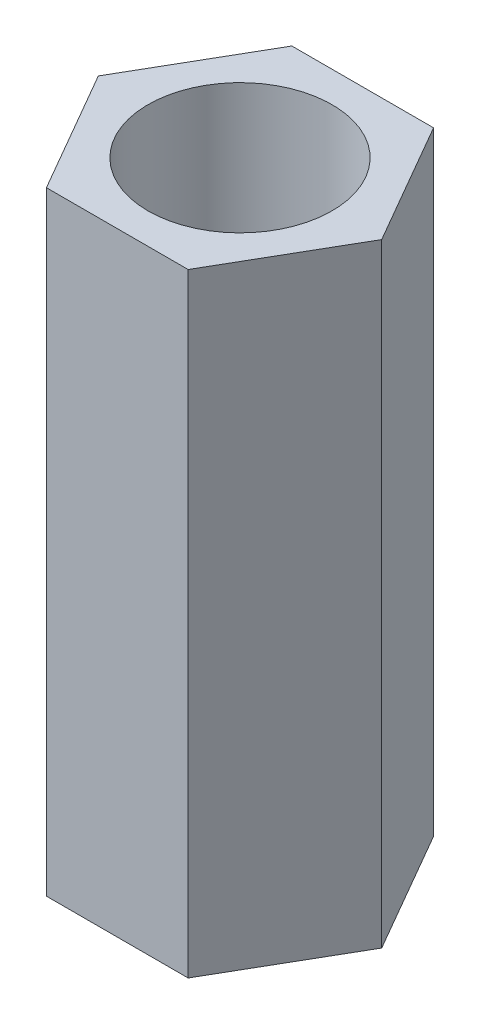
ISO-10303-21;
HEADER;
FILE_DESCRIPTION(('STEP AP214'),'2;1');
FILE_NAME('part.step','',(''),(''),'','','');
FILE_SCHEMA(('AUTOMOTIVE_DESIGN { 1 0 10303 214 1 1 1 1 }'));
ENDSEC;
DATA;
#1=APPLICATION_CONTEXT('core data for automotive mechanical design processes');
#2=APPLICATION_PROTOCOL_DEFINITION('international standard','automotive_design',2000,#1);
#3=PRODUCT_CONTEXT('',#1,'mechanical');
#4=PRODUCT('Part','Part','',(#3));
#5=PRODUCT_RELATED_PRODUCT_CATEGORY('part','',(#4));
#6=PRODUCT_DEFINITION_FORMATION('','',#4);
#7=PRODUCT_DEFINITION_CONTEXT('part definition',#1,'design');
#8=PRODUCT_DEFINITION('design','',#6,#7);
#9=PRODUCT_DEFINITION_SHAPE('','',#8);
#10=(LENGTH_UNIT() NAMED_UNIT(*) SI_UNIT(.MILLI.,.METRE.));
#11=(NAMED_UNIT(*) PLANE_ANGLE_UNIT() SI_UNIT($,.RADIAN.));
#12=(NAMED_UNIT(*) SI_UNIT($,.STERADIAN.) SOLID_ANGLE_UNIT());
#13=UNCERTAINTY_MEASURE_WITH_UNIT(LENGTH_MEASURE(1.E-05),#10,'distance_accuracy_value','');
#14=(GEOMETRIC_REPRESENTATION_CONTEXT(3) GLOBAL_UNCERTAINTY_ASSIGNED_CONTEXT((#13)) GLOBAL_UNIT_ASSIGNED_CONTEXT((#10,
#11,#12)) REPRESENTATION_CONTEXT('',''));
#15=CARTESIAN_POINT('',(0.,0.,0.));
#16=DIRECTION('',(0.,0.,1.));
#17=DIRECTION('',(1.,0.,0.));
#18=AXIS2_PLACEMENT_3D('',#15,#16,#17);
#19=CARTESIAN_POINT('',(1.15470053837925,10.,2.));
#20=DIRECTION('',(-0.866025403784439,0.,-0.5));
#21=DIRECTION('',(-0.5,0.,0.866025403784439));
#22=AXIS2_PLACEMENT_3D('',#19,#20,#21);
#23=PLANE('',#22);
#24=DIRECTION('',(0.5,0.,-0.866025403784439));
#25=VECTOR('',#24,1.);
#26=CARTESIAN_POINT('',(1.15470053837925,0.,2.));
#27=LINE('',#26,#25);
#28=CARTESIAN_POINT('',(1.15470053837925,0.,2.));
#29=VERTEX_POINT('',#28);
#30=CARTESIAN_POINT('',(2.3094010767585,0.,0.));
#31=VERTEX_POINT('',#30);
#32=EDGE_CURVE('E129',#29,#31,#27,.T.);
#33=ORIENTED_EDGE('',*,*,#32,.T.);
#34=DIRECTION('',(0.,-1.,0.));
#35=VECTOR('',#34,1.);
#36=CARTESIAN_POINT('',(2.3094010767585,10.,0.));
#37=LINE('',#36,#35);
#38=CARTESIAN_POINT('',(2.3094010767585,10.,0.));
#39=VERTEX_POINT('',#38);
#40=EDGE_CURVE('E11',#39,#31,#37,.T.);
#41=ORIENTED_EDGE('',*,*,#40,.F.);
#42=DIRECTION('',(0.5,0.,-0.866025403784439));
#43=VECTOR('',#42,1.);
#44=CARTESIAN_POINT('',(1.15470053837925,10.,2.));
#45=LINE('',#44,#43);
#46=CARTESIAN_POINT('',(1.15470053837925,10.,2.));
#47=VERTEX_POINT('',#46);
#48=EDGE_CURVE('E140',#47,#39,#45,.T.);
#49=ORIENTED_EDGE('',*,*,#48,.F.);
#50=DIRECTION('',(0.,-1.,0.));
#51=VECTOR('',#50,1.);
#52=CARTESIAN_POINT('',(1.15470053837925,10.,2.));
#53=LINE('',#52,#51);
#54=EDGE_CURVE('E125',#47,#29,#53,.T.);
#55=ORIENTED_EDGE('',*,*,#54,.T.);
#56=EDGE_LOOP('',(#33,#41,#49,#55));
#57=FACE_BOUND('',#56,.T.);
#58=ADVANCED_FACE('F45',(#57),#23,.F.);
#59=CARTESIAN_POINT('',(2.3094010767585,10.,0.));
#60=DIRECTION('',(-0.866025403784439,0.,0.5));
#61=DIRECTION('',(0.5,0.,0.866025403784439));
#62=AXIS2_PLACEMENT_3D('',#59,#60,#61);
#63=PLANE('',#62);
#64=DIRECTION('',(-0.5,0.,-0.866025403784438));
#65=VECTOR('',#64,1.);
#66=CARTESIAN_POINT('',(2.3094010767585,0.,0.));
#67=LINE('',#66,#65);
#68=CARTESIAN_POINT('',(1.15470053837925,0.,-2.));
#69=VERTEX_POINT('',#68);
#70=EDGE_CURVE('E132',#31,#69,#67,.T.);
#71=ORIENTED_EDGE('',*,*,#70,.T.);
#72=DIRECTION('',(0.,-1.,0.));
#73=VECTOR('',#72,1.);
#74=CARTESIAN_POINT('',(1.15470053837925,10.,-2.));
#75=LINE('',#74,#73);
#76=CARTESIAN_POINT('',(1.15470053837925,10.,-2.));
#77=VERTEX_POINT('',#76);
#78=EDGE_CURVE('E53',#77,#69,#75,.T.);
#79=ORIENTED_EDGE('',*,*,#78,.F.);
#80=DIRECTION('',(-0.5,0.,-0.866025403784438));
#81=VECTOR('',#80,1.);
#82=CARTESIAN_POINT('',(2.3094010767585,10.,0.));
#83=LINE('',#82,#81);
#84=EDGE_CURVE('E98',#39,#77,#83,.T.);
#85=ORIENTED_EDGE('',*,*,#84,.F.);
#86=ORIENTED_EDGE('',*,*,#40,.T.);
#87=EDGE_LOOP('',(#71,#79,#85,#86));
#88=FACE_BOUND('',#87,.T.);
#89=ADVANCED_FACE('F165',(#88),#63,.F.);
#90=CARTESIAN_POINT('',(1.15470053837925,10.,-2.));
#91=DIRECTION('',(0.,0.,1.));
#92=DIRECTION('',(1.,0.,0.));
#93=AXIS2_PLACEMENT_3D('',#90,#91,#92);
#94=PLANE('',#93);
#95=DIRECTION('',(-1.,0.,0.));
#96=VECTOR('',#95,1.);
#97=CARTESIAN_POINT('',(1.15470053837925,0.,-2.));
#98=LINE('',#97,#96);
#99=CARTESIAN_POINT('',(-1.15470053837925,0.,-2.));
#100=VERTEX_POINT('',#99);
#101=EDGE_CURVE('E135',#69,#100,#98,.T.);
#102=ORIENTED_EDGE('',*,*,#101,.T.);
#103=DIRECTION('',(0.,-1.,0.));
#104=VECTOR('',#103,1.);
#105=CARTESIAN_POINT('',(-1.15470053837925,10.,-2.));
#106=LINE('',#105,#104);
#107=CARTESIAN_POINT('',(-1.15470053837925,10.,-2.));
#108=VERTEX_POINT('',#107);
#109=EDGE_CURVE('E120',#108,#100,#106,.T.);
#110=ORIENTED_EDGE('',*,*,#109,.F.);
#111=DIRECTION('',(-1.,0.,0.));
#112=VECTOR('',#111,1.);
#113=CARTESIAN_POINT('',(1.15470053837925,10.,-2.));
#114=LINE('',#113,#112);
#115=EDGE_CURVE('E111',#77,#108,#114,.T.);
#116=ORIENTED_EDGE('',*,*,#115,.F.);
#117=ORIENTED_EDGE('',*,*,#78,.T.);
#118=EDGE_LOOP('',(#102,#110,#116,#117));
#119=FACE_BOUND('',#118,.T.);
#120=ADVANCED_FACE('F146',(#119),#94,.F.);
#121=CARTESIAN_POINT('',(-1.15470053837925,10.,-2.));
#122=DIRECTION('',(0.866025403784439,0.,0.5));
#123=DIRECTION('',(0.5,0.,-0.866025403784439));
#124=AXIS2_PLACEMENT_3D('',#121,#122,#123);
#125=PLANE('',#124);
#126=DIRECTION('',(-0.5,0.,0.866025403784439));
#127=VECTOR('',#126,1.);
#128=CARTESIAN_POINT('',(-1.15470053837925,0.,-2.));
#129=LINE('',#128,#127);
#130=CARTESIAN_POINT('',(-2.3094010767585,0.,0.));
#131=VERTEX_POINT('',#130);
#132=EDGE_CURVE('E119',#100,#131,#129,.T.);
#133=ORIENTED_EDGE('',*,*,#132,.T.);
#134=DIRECTION('',(0.,-1.,0.));
#135=VECTOR('',#134,1.);
#136=CARTESIAN_POINT('',(-2.3094010767585,10.,0.));
#137=LINE('',#136,#135);
#138=CARTESIAN_POINT('',(-2.3094010767585,10.,0.));
#139=VERTEX_POINT('',#138);
#140=EDGE_CURVE('E116',#139,#131,#137,.T.);
#141=ORIENTED_EDGE('',*,*,#140,.F.);
#142=DIRECTION('',(-0.5,0.,0.866025403784439));
#143=VECTOR('',#142,1.);
#144=CARTESIAN_POINT('',(-1.15470053837925,10.,-2.));
#145=LINE('',#144,#143);
#146=EDGE_CURVE('E105',#108,#139,#145,.T.);
#147=ORIENTED_EDGE('',*,*,#146,.F.);
#148=ORIENTED_EDGE('',*,*,#109,.T.);
#149=EDGE_LOOP('',(#133,#141,#147,#148));
#150=FACE_BOUND('',#149,.T.);
#151=ADVANCED_FACE('F117',(#150),#125,.F.);
#152=CARTESIAN_POINT('',(-2.3094010767585,10.,0.));
#153=DIRECTION('',(0.866025403784439,0.,-0.5));
#154=DIRECTION('',(-0.5,0.,-0.866025403784439));
#155=AXIS2_PLACEMENT_3D('',#152,#153,#154);
#156=PLANE('',#155);
#157=DIRECTION('',(0.5,0.,0.866025403784439));
#158=VECTOR('',#157,1.);
#159=CARTESIAN_POINT('',(-2.3094010767585,0.,0.));
#160=LINE('',#159,#158);
#161=CARTESIAN_POINT('',(-1.15470053837925,0.,2.));
#162=VERTEX_POINT('',#161);
#163=EDGE_CURVE('E84',#131,#162,#160,.T.);
#164=ORIENTED_EDGE('',*,*,#163,.T.);
#165=DIRECTION('',(0.,-1.,0.));
#166=VECTOR('',#165,1.);
#167=CARTESIAN_POINT('',(-1.15470053837925,10.,2.));
#168=LINE('',#167,#166);
#169=CARTESIAN_POINT('',(-1.15470053837925,10.,2.));
#170=VERTEX_POINT('',#169);
#171=EDGE_CURVE('E121',#170,#162,#168,.T.);
#172=ORIENTED_EDGE('',*,*,#171,.F.);
#173=DIRECTION('',(0.5,0.,0.866025403784439));
#174=VECTOR('',#173,1.);
#175=CARTESIAN_POINT('',(-2.3094010767585,10.,0.));
#176=LINE('',#175,#174);
#177=EDGE_CURVE('E109',#139,#170,#176,.T.);
#178=ORIENTED_EDGE('',*,*,#177,.F.);
#179=ORIENTED_EDGE('',*,*,#140,.T.);
#180=EDGE_LOOP('',(#164,#172,#178,#179));
#181=FACE_BOUND('',#180,.T.);
#182=ADVANCED_FACE('F123',(#181),#156,.F.);
#183=CARTESIAN_POINT('',(-1.15470053837925,10.,2.));
#184=DIRECTION('',(0.,0.,-1.));
#185=DIRECTION('',(-1.,0.,0.));
#186=AXIS2_PLACEMENT_3D('',#183,#184,#185);
#187=PLANE('',#186);
#188=DIRECTION('',(1.,0.,0.));
#189=VECTOR('',#188,1.);
#190=CARTESIAN_POINT('',(-1.15470053837925,0.,2.));
#191=LINE('',#190,#189);
#192=EDGE_CURVE('E90',#162,#29,#191,.T.);
#193=ORIENTED_EDGE('',*,*,#192,.T.);
#194=ORIENTED_EDGE('',*,*,#54,.F.);
#195=DIRECTION('',(1.,0.,0.));
#196=VECTOR('',#195,1.);
#197=CARTESIAN_POINT('',(-1.15470053837925,10.,2.));
#198=LINE('',#197,#196);
#199=EDGE_CURVE('E61',#170,#47,#198,.T.);
#200=ORIENTED_EDGE('',*,*,#199,.F.);
#201=ORIENTED_EDGE('',*,*,#171,.T.);
#202=EDGE_LOOP('',(#193,#194,#200,#201));
#203=FACE_BOUND('',#202,.T.);
#204=ADVANCED_FACE('F153',(#203),#187,.F.);
#205=CARTESIAN_POINT('',(0.,10.,0.));
#206=DIRECTION('',(0.,1.,0.));
#207=DIRECTION('',(0.,0.,1.));
#208=AXIS2_PLACEMENT_3D('',#205,#206,#207);
#209=PLANE('',#208);
#210=CARTESIAN_POINT('',(0.,10.,0.));
#211=DIRECTION('',(0.,1.,0.));
#212=DIRECTION('',(0.,0.,1.));
#213=AXIS2_PLACEMENT_3D('',#210,#211,#212);
#214=CIRCLE('',#213,1.5);
#215=CARTESIAN_POINT('',(0.,10.,1.5));
#216=VERTEX_POINT('',#215);
#217=EDGE_CURVE('E239',#216,#216,#214,.T.);
#218=ORIENTED_EDGE('',*,*,#217,.F.);
#219=EDGE_LOOP('',(#218));
#220=FACE_BOUND('',#219,.T.);
#221=ORIENTED_EDGE('',*,*,#48,.T.);
#222=ORIENTED_EDGE('',*,*,#84,.T.);
#223=ORIENTED_EDGE('',*,*,#115,.T.);
#224=ORIENTED_EDGE('',*,*,#146,.T.);
#225=ORIENTED_EDGE('',*,*,#177,.T.);
#226=ORIENTED_EDGE('',*,*,#199,.T.);
#227=EDGE_LOOP('',(#221,#222,#223,#224,#225,#226));
#228=FACE_BOUND('',#227,.T.);
#229=ADVANCED_FACE('F107',(#220,#228),#209,.T.);
#230=CARTESIAN_POINT('',(0.,0.,0.));
#231=DIRECTION('',(0.,1.,0.));
#232=DIRECTION('',(0.,0.,1.));
#233=AXIS2_PLACEMENT_3D('',#230,#231,#232);
#234=PLANE('',#233);
#235=CARTESIAN_POINT('',(0.,0.,0.));
#236=DIRECTION('',(0.,1.,0.));
#237=DIRECTION('',(0.,0.,1.));
#238=AXIS2_PLACEMENT_3D('',#235,#236,#237);
#239=CIRCLE('',#238,1.5);
#240=CARTESIAN_POINT('',(0.,0.,1.5));
#241=VERTEX_POINT('',#240);
#242=EDGE_CURVE('E133',#241,#241,#239,.T.);
#243=ORIENTED_EDGE('',*,*,#242,.T.);
#244=EDGE_LOOP('',(#243));
#245=FACE_BOUND('',#244,.T.);
#246=ORIENTED_EDGE('',*,*,#32,.F.);
#247=ORIENTED_EDGE('',*,*,#192,.F.);
#248=ORIENTED_EDGE('',*,*,#163,.F.);
#249=ORIENTED_EDGE('',*,*,#132,.F.);
#250=ORIENTED_EDGE('',*,*,#101,.F.);
#251=ORIENTED_EDGE('',*,*,#70,.F.);
#252=EDGE_LOOP('',(#246,#247,#248,#249,#250,#251));
#253=FACE_BOUND('',#252,.T.);
#254=ADVANCED_FACE('F149',(#245,#253),#234,.F.);
#255=CARTESIAN_POINT('',(0.,0.,0.));
#256=DIRECTION('',(0.,1.,0.));
#257=DIRECTION('',(0.,0.,1.));
#258=AXIS2_PLACEMENT_3D('',#255,#256,#257);
#259=CYLINDRICAL_SURFACE('',#258,1.5);
#260=ORIENTED_EDGE('',*,*,#242,.F.);
#261=EDGE_LOOP('',(#260));
#262=FACE_BOUND('',#261,.T.);
#263=ORIENTED_EDGE('',*,*,#217,.T.);
#264=EDGE_LOOP('',(#263));
#265=FACE_BOUND('',#264,.T.);
#266=ADVANCED_FACE('F204',(#262,#265),#259,.F.);
#267=CLOSED_SHELL('',(#58,#89,#120,#151,#182,#204,#229,#254,#266));
#268=MANIFOLD_SOLID_BREP('B2',#267);
#269=ADVANCED_BREP_SHAPE_REPRESENTATION('',(#18,#268),#14);
#270=SHAPE_DEFINITION_REPRESENTATION(#9,#269);
ENDSEC;
END-ISO-10303-21;
